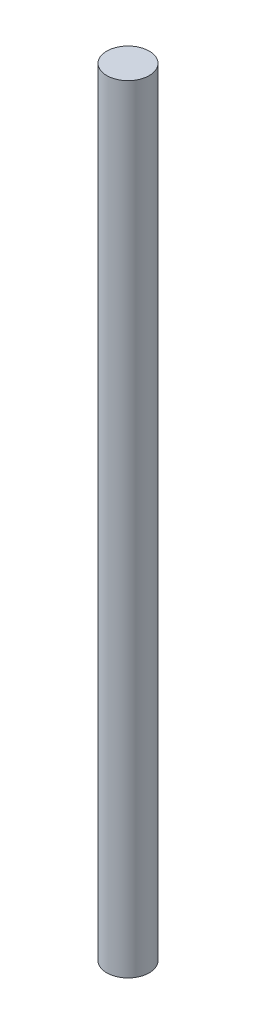
ISO-10303-21;
HEADER;
FILE_DESCRIPTION(('STEP AP214'),'2;1');
FILE_NAME('part.step','',(''),(''),'','','');
FILE_SCHEMA(('AUTOMOTIVE_DESIGN { 1 0 10303 214 1 1 1 1 }'));
ENDSEC;
DATA;
#1=APPLICATION_CONTEXT('core data for automotive mechanical design processes');
#2=APPLICATION_PROTOCOL_DEFINITION('international standard','automotive_design',2000,#1);
#3=PRODUCT_CONTEXT('',#1,'mechanical');
#4=PRODUCT('Part','Part','',(#3));
#5=PRODUCT_RELATED_PRODUCT_CATEGORY('part','',(#4));
#6=PRODUCT_DEFINITION_FORMATION('','',#4);
#7=PRODUCT_DEFINITION_CONTEXT('part definition',#1,'design');
#8=PRODUCT_DEFINITION('design','',#6,#7);
#9=PRODUCT_DEFINITION_SHAPE('','',#8);
#10=(LENGTH_UNIT() NAMED_UNIT(*) SI_UNIT(.MILLI.,.METRE.));
#11=(NAMED_UNIT(*) PLANE_ANGLE_UNIT() SI_UNIT($,.RADIAN.));
#12=(NAMED_UNIT(*) SI_UNIT($,.STERADIAN.) SOLID_ANGLE_UNIT());
#13=UNCERTAINTY_MEASURE_WITH_UNIT(LENGTH_MEASURE(1.E-05),#10,'distance_accuracy_value','');
#14=(GEOMETRIC_REPRESENTATION_CONTEXT(3) GLOBAL_UNCERTAINTY_ASSIGNED_CONTEXT((#13)) GLOBAL_UNIT_ASSIGNED_CONTEXT((#10,
#11,#12)) REPRESENTATION_CONTEXT('',''));
#15=CARTESIAN_POINT('',(0.,0.,0.));
#16=DIRECTION('',(0.,0.,1.));
#17=DIRECTION('',(1.,0.,0.));
#18=AXIS2_PLACEMENT_3D('',#15,#16,#17);
#19=CARTESIAN_POINT('',(0.,76.2,0.));
#20=DIRECTION('',(0.,-1.,0.));
#21=DIRECTION('',(0.,0.,-1.));
#22=AXIS2_PLACEMENT_3D('',#19,#20,#21);
#23=CYLINDRICAL_SURFACE('',#22,2.0828);
#24=CARTESIAN_POINT('',(0.,76.2,0.));
#25=DIRECTION('',(0.,1.,0.));
#26=DIRECTION('',(0.,0.,1.));
#27=AXIS2_PLACEMENT_3D('',#24,#25,#26);
#28=CIRCLE('',#27,2.0828);
#29=CARTESIAN_POINT('',(0.,76.2,-2.0828));
#30=VERTEX_POINT('',#29);
#31=EDGE_CURVE('E10',#30,#30,#28,.T.);
#32=CARTESIAN_POINT('',(0.,0.,0.));
#33=DIRECTION('',(0.,1.,0.));
#34=DIRECTION('',(0.,0.,1.));
#35=AXIS2_PLACEMENT_3D('',#32,#33,#34);
#36=CIRCLE('',#35,2.0828);
#37=CARTESIAN_POINT('',(0.,0.,-2.0828));
#38=VERTEX_POINT('',#37);
#39=EDGE_CURVE('E38',#38,#38,#36,.T.);
#40=CARTESIAN_POINT('',(0.,76.2,-2.0828));
#41=CARTESIAN_POINT('',(0.,75.40625,-2.0828));
#42=CARTESIAN_POINT('',(0.,74.6125,-2.0828));
#43=CARTESIAN_POINT('',(0.,73.025,-2.0828));
#44=CARTESIAN_POINT('',(0.,72.23125,-2.0828));
#45=CARTESIAN_POINT('',(0.,70.64375,-2.0828));
#46=CARTESIAN_POINT('',(0.,69.85,-2.0828));
#47=CARTESIAN_POINT('',(0.,68.2625,-2.0828));
#48=CARTESIAN_POINT('',(0.,67.46875,-2.0828));
#49=CARTESIAN_POINT('',(0.,65.88125,-2.0828));
#50=CARTESIAN_POINT('',(0.,65.0875,-2.0828));
#51=CARTESIAN_POINT('',(0.,63.5,-2.0828));
#52=CARTESIAN_POINT('',(0.,62.70625,-2.0828));
#53=CARTESIAN_POINT('',(0.,61.11875,-2.0828));
#54=CARTESIAN_POINT('',(0.,60.325,-2.0828));
#55=CARTESIAN_POINT('',(0.,58.7375,-2.0828));
#56=CARTESIAN_POINT('',(0.,57.94375,-2.0828));
#57=CARTESIAN_POINT('',(0.,56.35625,-2.0828));
#58=CARTESIAN_POINT('',(0.,55.5625,-2.0828));
#59=CARTESIAN_POINT('',(0.,53.975,-2.0828));
#60=CARTESIAN_POINT('',(0.,53.18125,-2.0828));
#61=CARTESIAN_POINT('',(0.,51.59375,-2.0828));
#62=CARTESIAN_POINT('',(0.,50.8,-2.0828));
#63=CARTESIAN_POINT('',(0.,49.2125,-2.0828));
#64=CARTESIAN_POINT('',(0.,48.41875,-2.0828));
#65=CARTESIAN_POINT('',(0.,46.83125,-2.0828));
#66=CARTESIAN_POINT('',(0.,46.0375,-2.0828));
#67=CARTESIAN_POINT('',(0.,44.45,-2.0828));
#68=CARTESIAN_POINT('',(0.,43.65625,-2.0828));
#69=CARTESIAN_POINT('',(0.,42.06875,-2.0828));
#70=CARTESIAN_POINT('',(0.,41.275,-2.0828));
#71=CARTESIAN_POINT('',(0.,39.6875,-2.0828));
#72=CARTESIAN_POINT('',(0.,38.89375,-2.0828));
#73=CARTESIAN_POINT('',(0.,37.30625,-2.0828));
#74=CARTESIAN_POINT('',(0.,36.5125,-2.0828));
#75=CARTESIAN_POINT('',(0.,34.925,-2.0828));
#76=CARTESIAN_POINT('',(0.,34.13125,-2.0828));
#77=CARTESIAN_POINT('',(0.,32.54375,-2.0828));
#78=CARTESIAN_POINT('',(0.,31.75,-2.0828));
#79=CARTESIAN_POINT('',(0.,30.1625,-2.0828));
#80=CARTESIAN_POINT('',(0.,29.36875,-2.0828));
#81=CARTESIAN_POINT('',(0.,27.78125,-2.0828));
#82=CARTESIAN_POINT('',(0.,26.9875,-2.0828));
#83=CARTESIAN_POINT('',(0.,25.4,-2.0828));
#84=CARTESIAN_POINT('',(0.,24.60625,-2.0828));
#85=CARTESIAN_POINT('',(0.,23.01875,-2.0828));
#86=CARTESIAN_POINT('',(0.,22.225,-2.0828));
#87=CARTESIAN_POINT('',(0.,20.6375,-2.0828));
#88=CARTESIAN_POINT('',(0.,19.84375,-2.0828));
#89=CARTESIAN_POINT('',(0.,18.25625,-2.0828));
#90=CARTESIAN_POINT('',(0.,17.4625,-2.0828));
#91=CARTESIAN_POINT('',(0.,15.875,-2.0828));
#92=CARTESIAN_POINT('',(0.,15.08125,-2.0828));
#93=CARTESIAN_POINT('',(0.,13.49375,-2.0828));
#94=CARTESIAN_POINT('',(0.,12.7,-2.0828));
#95=CARTESIAN_POINT('',(0.,11.1125,-2.0828));
#96=CARTESIAN_POINT('',(0.,10.31875,-2.0828));
#97=CARTESIAN_POINT('',(0.,8.73125,-2.0828));
#98=CARTESIAN_POINT('',(0.,7.93750000000001,-2.0828));
#99=CARTESIAN_POINT('',(0.,6.35,-2.0828));
#100=CARTESIAN_POINT('',(0.,5.55625,-2.0828));
#101=CARTESIAN_POINT('',(0.,3.96875,-2.0828));
#102=CARTESIAN_POINT('',(0.,3.175,-2.0828));
#103=CARTESIAN_POINT('',(0.,1.5875,-2.0828));
#104=CARTESIAN_POINT('',(0.,0.793750000000001,-2.0828));
#105=CARTESIAN_POINT('',(0.,0.,-2.0828));
#106=B_SPLINE_CURVE_WITH_KNOTS('',3,(#40,#41,#42,#43,#44,#45,#46,#47,#48,#49,#50,#51,#52,#53,
#54,#55,#56,#57,#58,#59,#60,#61,#62,#63,#64,#65,#66,#67,#68,#69,#70,#71,#72,#73,#74,#75,#76,#77,
#78,#79,#80,#81,#82,#83,#84,#85,#86,#87,#88,#89,#90,#91,#92,#93,#94,#95,#96,#97,#98,#99,#100,
#101,#102,#103,#104,#105),.UNSPECIFIED.,.F.,.F.,(4,2,2,2,2,2,2,2,2,2,2,2,2,2,2,2,2,2,2,2,2,2,2,
2,2,2,2,2,2,2,2,2,4),(0.,2.38124999999999,4.76249999999999,7.14374999999999,9.52499999999999,
11.90625,14.2875,16.66875,19.05,21.43125,23.8125,26.19375,28.575,30.95625,33.3375,35.71875,38.1,
40.48125,42.8625,45.24375,47.625,50.00625,52.3875,54.76875,57.15,59.53125,61.9125,64.29375,
66.675,69.05625,71.4375,73.81875,76.2),.UNSPECIFIED.);
#107=EDGE_CURVE('BSEAM35',#30,#38,#106,.T.);
#108=ORIENTED_EDGE('',*,*,#31,.F.);
#109=ORIENTED_EDGE('',*,*,#39,.T.);
#110=ORIENTED_EDGE('',*,*,#107,.T.);
#111=ORIENTED_EDGE('',*,*,#107,.F.);
#112=EDGE_LOOP('',(#108,#110,#109,#111));
#113=FACE_BOUND('',#112,.T.);
#114=ADVANCED_FACE('F35',(#113),#23,.T.);
#115=CARTESIAN_POINT('',(0.,76.2,0.));
#116=DIRECTION('',(0.,1.,0.));
#117=DIRECTION('',(0.,0.,1.));
#118=AXIS2_PLACEMENT_3D('',#115,#116,#117);
#119=PLANE('',#118);
#120=ORIENTED_EDGE('',*,*,#31,.T.);
#121=EDGE_LOOP('',(#120));
#122=FACE_BOUND('',#121,.T.);
#123=ADVANCED_FACE('F50',(#122),#119,.T.);
#124=CARTESIAN_POINT('',(0.,0.,0.));
#125=DIRECTION('',(0.,1.,0.));
#126=DIRECTION('',(0.,0.,1.));
#127=AXIS2_PLACEMENT_3D('',#124,#125,#126);
#128=PLANE('',#127);
#129=ORIENTED_EDGE('',*,*,#39,.F.);
#130=EDGE_LOOP('',(#129));
#131=FACE_BOUND('',#130,.T.);
#132=ADVANCED_FACE('F48',(#131),#128,.F.);
#133=CLOSED_SHELL('',(#114,#123,#132));
#134=MANIFOLD_SOLID_BREP('B2',#133);
#135=ADVANCED_BREP_SHAPE_REPRESENTATION('',(#18,#134),#14);
#136=SHAPE_DEFINITION_REPRESENTATION(#9,#135);
ENDSEC;
END-ISO-10303-21;
